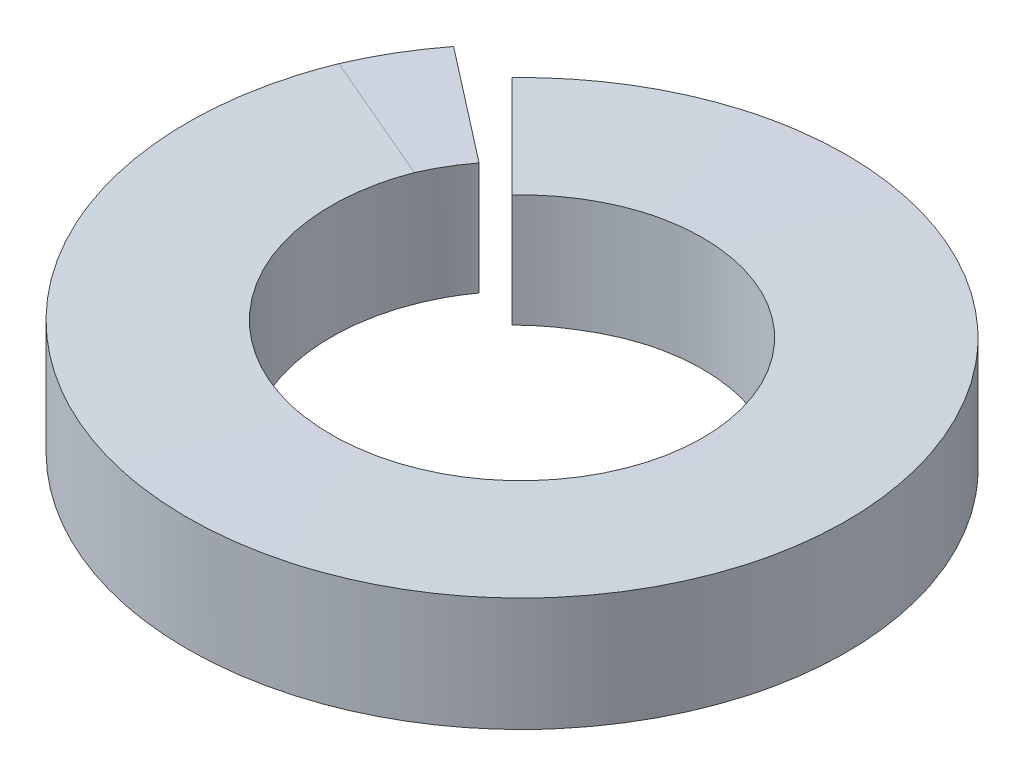
ISO-10303-21;
HEADER;
FILE_DESCRIPTION(('STEP AP214'),'2;1');
FILE_NAME('part.step','',(''),(''),'','','');
FILE_SCHEMA(('AUTOMOTIVE_DESIGN { 1 0 10303 214 1 1 1 1 }'));
ENDSEC;
DATA;
#1=APPLICATION_CONTEXT('core data for automotive mechanical design processes');
#2=APPLICATION_PROTOCOL_DEFINITION('international standard','automotive_design',2000,#1);
#3=PRODUCT_CONTEXT('',#1,'mechanical');
#4=PRODUCT('Part','Part','',(#3));
#5=PRODUCT_RELATED_PRODUCT_CATEGORY('part','',(#4));
#6=PRODUCT_DEFINITION_FORMATION('','',#4);
#7=PRODUCT_DEFINITION_CONTEXT('part definition',#1,'design');
#8=PRODUCT_DEFINITION('design','',#6,#7);
#9=PRODUCT_DEFINITION_SHAPE('','',#8);
#10=(LENGTH_UNIT() NAMED_UNIT(*) SI_UNIT(.MILLI.,.METRE.));
#11=(NAMED_UNIT(*) PLANE_ANGLE_UNIT() SI_UNIT($,.RADIAN.));
#12=(NAMED_UNIT(*) SI_UNIT($,.STERADIAN.) SOLID_ANGLE_UNIT());
#13=UNCERTAINTY_MEASURE_WITH_UNIT(LENGTH_MEASURE(1.E-05),#10,'distance_accuracy_value','');
#14=(GEOMETRIC_REPRESENTATION_CONTEXT(3) GLOBAL_UNCERTAINTY_ASSIGNED_CONTEXT((#13)) GLOBAL_UNIT_ASSIGNED_CONTEXT((#10,
#11,#12)) REPRESENTATION_CONTEXT('',''));
#15=CARTESIAN_POINT('',(0.,0.,0.));
#16=DIRECTION('',(0.,0.,1.));
#17=DIRECTION('',(1.,0.,0.));
#18=AXIS2_PLACEMENT_3D('',#15,#16,#17);
#19=CARTESIAN_POINT('',(0.,-0.0956628975394009,0.));
#20=DIRECTION('',(0.707113186219945,0.,-0.707100376095132));
#21=DIRECTION('',(-0.707100376095132,0.,-0.707113186219945));
#22=AXIS2_PLACEMENT_3D('',#19,#20,#21);
#23=PLANE('',#22);
#24=DIRECTION('',(0.,1.,0.));
#25=VECTOR('',#24,1.);
#26=CARTESIAN_POINT('',(-1.94452603426161,0.379337102460599,-1.94456126210485));
#27=LINE('',#26,#25);
#28=CARTESIAN_POINT('',(-1.94452603426161,-0.560662897539401,-1.94456126210485));
#29=VERTEX_POINT('',#28);
#30=CARTESIAN_POINT('',(-1.94452603426161,0.379337102460599,-1.94456126210485));
#31=VERTEX_POINT('',#30);
#32=EDGE_CURVE('E110',#29,#31,#27,.T.);
#33=ORIENTED_EDGE('',*,*,#32,.F.);
#34=DIRECTION('',(0.707100376095132,0.,0.707113186219945));
#35=VECTOR('',#34,1.);
#36=CARTESIAN_POINT('',(0.,-0.560662897539401,0.));
#37=LINE('',#36,#35);
#38=CARTESIAN_POINT('',(-1.09600558294745,-0.560662897539402,-1.09602543864091));
#39=VERTEX_POINT('',#38);
#40=EDGE_CURVE('E47',#29,#39,#37,.T.);
#41=ORIENTED_EDGE('',*,*,#40,.T.);
#42=DIRECTION('',(0.,-1.,0.));
#43=VECTOR('',#42,1.);
#44=CARTESIAN_POINT('',(-1.09600558294745,0.379337102460599,-1.09602543864091));
#45=LINE('',#44,#43);
#46=CARTESIAN_POINT('',(-1.09600558294745,0.379337102460599,-1.09602543864091));
#47=VERTEX_POINT('',#46);
#48=EDGE_CURVE('E134',#47,#39,#45,.T.);
#49=ORIENTED_EDGE('',*,*,#48,.F.);
#50=DIRECTION('',(0.707100376095132,0.,0.707113186219945));
#51=VECTOR('',#50,1.);
#52=CARTESIAN_POINT('',(-1.09600558294745,0.379337102460599,-1.09602543864091));
#53=LINE('',#52,#51);
#54=EDGE_CURVE('E105',#31,#47,#53,.T.);
#55=ORIENTED_EDGE('',*,*,#54,.F.);
#56=EDGE_LOOP('',(#33,#41,#49,#55));
#57=FACE_BOUND('',#56,.T.);
#58=ADVANCED_FACE('F34',(#57),#23,.F.);
#59=CARTESIAN_POINT('',(0.,0.154337102460599,0.));
#60=DIRECTION('',(0.612914210951601,0.,-0.790149460553873));
#61=DIRECTION('',(-0.790149460553873,0.,-0.612914210951601));
#62=AXIS2_PLACEMENT_3D('',#59,#60,#61);
#63=PLANE('',#62);
#64=DIRECTION('',(-0.790149460553873,0.,-0.612914210951601));
#65=VECTOR('',#64,1.);
#66=CARTESIAN_POINT('',(0.,0.619337102460599,0.));
#67=LINE('',#66,#65);
#68=CARTESIAN_POINT('',(-1.2247316638585,0.619337102460599,-0.950017026974984));
#69=VERTEX_POINT('',#68);
#70=CARTESIAN_POINT('',(-2.17291101652315,0.619337102460599,-1.68551408011691));
#71=VERTEX_POINT('',#70);
#72=EDGE_CURVE('E100',#69,#71,#67,.T.);
#73=ORIENTED_EDGE('',*,*,#72,.F.);
#74=DIRECTION('',(0.,-1.,0.));
#75=VECTOR('',#74,1.);
#76=CARTESIAN_POINT('',(-1.2247316638585,0.629337102460599,-0.950017026974982));
#77=LINE('',#76,#75);
#78=CARTESIAN_POINT('',(-1.2247316638585,-0.320662897539401,-0.950017026974984));
#79=VERTEX_POINT('',#78);
#80=EDGE_CURVE('E99',#69,#79,#77,.T.);
#81=ORIENTED_EDGE('',*,*,#80,.T.);
#82=DIRECTION('',(-0.790149460553873,0.,-0.612914210951601));
#83=VECTOR('',#82,1.);
#84=CARTESIAN_POINT('',(-1.2247316638585,-0.320662897539401,-0.950017026974982));
#85=LINE('',#84,#83);
#86=CARTESIAN_POINT('',(-2.17291101652315,-0.320662897539401,-1.68551408011691));
#87=VERTEX_POINT('',#86);
#88=EDGE_CURVE('E118',#79,#87,#85,.T.);
#89=ORIENTED_EDGE('',*,*,#88,.T.);
#90=DIRECTION('',(0.,1.,0.));
#91=VECTOR('',#90,1.);
#92=CARTESIAN_POINT('',(-2.17291101652315,0.629337102460599,-1.6855140801169));
#93=LINE('',#92,#91);
#94=EDGE_CURVE('E90',#87,#71,#93,.T.);
#95=ORIENTED_EDGE('',*,*,#94,.T.);
#96=EDGE_LOOP('',(#73,#81,#89,#95));
#97=FACE_BOUND('',#96,.T.);
#98=ADVANCED_FACE('F194',(#97),#63,.T.);
#99=CARTESIAN_POINT('',(0.,0.,0.));
#100=DIRECTION('',(0.,1.,0.));
#101=DIRECTION('',(0.,0.,1.));
#102=AXIS2_PLACEMENT_3D('',#99,#100,#101);
#103=CYLINDRICAL_SURFACE('',#102,1.55);
#104=CARTESIAN_POINT('',(0.,-0.560662897539401,0.));
#105=DIRECTION('',(0.,1.,0.));
#106=DIRECTION('',(-1.,0.,0.));
#107=AXIS2_PLACEMENT_3D('',#104,#105,#106);
#108=CIRCLE('',#107,1.55);
#109=CARTESIAN_POINT('',(-0.784097116493194,-0.560662897539402,-1.337045889978));
#110=VERTEX_POINT('',#109);
#111=EDGE_CURVE('E167',#110,#39,#108,.T.);
#112=ORIENTED_EDGE('',*,*,#111,.F.);
#113=CARTESIAN_POINT('',(-1.09600558294745,-0.570662897539401,-1.09602543864091));
#114=CARTESIAN_POINT('',(-0.478426987407626,-0.549829564206068,-1.71359284607247));
#115=CARTESIAN_POINT('',(0.369740494049661,-0.528996230872735,-1.50525478476566));
#116=CARTESIAN_POINT('',(1.21790797550695,-0.508162897539401,-1.29691672345885));
#117=CARTESIAN_POINT('',(1.47907670770083,-0.487329564206068,-0.463499830352577));
#118=CARTESIAN_POINT('',(1.74024543989472,-0.466496230872734,0.369917062753697));
#119=CARTESIAN_POINT('',(1.16266287299777,-0.445662897539401,1.02504392284066));
#120=CARTESIAN_POINT('',(0.585080306100818,-0.424829564206068,1.68017078292763));
#121=CARTESIAN_POINT('',(-0.274495165684428,-0.403996230872734,1.52550070600307));
#122=CARTESIAN_POINT('',(-1.13407063746967,-0.383162897539401,1.37083062907852));
#123=CARTESIAN_POINT('',(-1.44705469253154,-0.362329564206068,0.555457214214071));
#124=CARTESIAN_POINT('',(-1.7600387475934,-0.341496230872734,-0.259916200650374));
#125=CARTESIAN_POINT('',(-1.2247316638585,-0.320662897539401,-0.950017026974986));
#126=(BOUNDED_CURVE() B_SPLINE_CURVE(2,(#113,#114,#115,#116,#117,#118,#119,#120,#121,#122,#123,
#124,#125),.UNSPECIFIED.,.F.,.F.) B_SPLINE_CURVE_WITH_KNOTS((3,2,2,2,2,2,3),(0.,
0.166666666666667,0.333333333333333,0.5,0.666666666666667,0.833333333333333,1.),
.UNSPECIFIED.) CURVE() GEOMETRIC_REPRESENTATION_ITEM() RATIONAL_B_SPLINE_CURVE((1.,
0.871213811120189,1.,0.871213811120189,1.,0.871213811120189,1.,0.871213811120189,1.,
0.871213811120189,1.,0.871213811120189,1.)) REPRESENTATION_ITEM(''));
#127=EDGE_CURVE('E106',#110,#79,#126,.T.);
#128=ORIENTED_EDGE('',*,*,#127,.T.);
#129=ORIENTED_EDGE('',*,*,#80,.F.);
#130=CARTESIAN_POINT('',(0.,0.619337102460599,0.));
#131=DIRECTION('',(0.,-1.,0.));
#132=DIRECTION('',(1.,0.,0.));
#133=AXIS2_PLACEMENT_3D('',#130,#131,#132);
#134=CIRCLE('',#133,1.55);
#135=CARTESIAN_POINT('',(-1.42476525354699,0.619337102460599,-0.610363803223271));
#136=VERTEX_POINT('',#135);
#137=EDGE_CURVE('E84',#136,#69,#134,.T.);
#138=ORIENTED_EDGE('',*,*,#137,.F.);
#139=CARTESIAN_POINT('',(-1.09600558294745,0.379337102460599,-1.09602543864091));
#140=CARTESIAN_POINT('',(-0.478426987407627,0.400170435793932,-1.71359284607247));
#141=CARTESIAN_POINT('',(0.36974049404966,0.421003769127266,-1.50525478476566));
#142=CARTESIAN_POINT('',(1.21790797550695,0.441837102460599,-1.29691672345885));
#143=CARTESIAN_POINT('',(1.47907670770083,0.462670435793932,-0.463499830352579));
#144=CARTESIAN_POINT('',(1.74024543989472,0.483503769127266,0.369917062753694));
#145=CARTESIAN_POINT('',(1.16266287299777,0.504337102460599,1.02504392284066));
#146=CARTESIAN_POINT('',(0.585080306100822,0.525170435793932,1.68017078292763));
#147=CARTESIAN_POINT('',(-0.274495165684424,0.546003769127266,1.52550070600307));
#148=CARTESIAN_POINT('',(-1.13407063746967,0.566837102460599,1.37083062907852));
#149=CARTESIAN_POINT('',(-1.44705469253154,0.587670435793932,0.555457214214076));
#150=CARTESIAN_POINT('',(-1.7600387475934,0.608503769127266,-0.259916200650368));
#151=CARTESIAN_POINT('',(-1.2247316638585,0.629337102460599,-0.950017026974982));
#152=(BOUNDED_CURVE() B_SPLINE_CURVE(2,(#139,#140,#141,#142,#143,#144,#145,#146,#147,#148,#149,
#150,#151),.UNSPECIFIED.,.F.,.F.) B_SPLINE_CURVE_WITH_KNOTS((3,2,2,2,2,2,3),(0.,
0.166666666666667,0.333333333333333,0.5,0.666666666666667,0.833333333333333,1.),
.UNSPECIFIED.) CURVE() GEOMETRIC_REPRESENTATION_ITEM() RATIONAL_B_SPLINE_CURVE((1.,
0.871213811120189,1.,0.871213811120189,1.,0.871213811120189,1.,0.871213811120189,1.,
0.871213811120189,1.,0.871213811120189,1.)) REPRESENTATION_ITEM(''));
#153=EDGE_CURVE('E97',#47,#136,#152,.T.);
#154=ORIENTED_EDGE('',*,*,#153,.F.);
#155=ORIENTED_EDGE('',*,*,#48,.T.);
#156=EDGE_LOOP('',(#112,#128,#129,#138,#154,#155));
#157=FACE_BOUND('',#156,.T.);
#158=ADVANCED_FACE('F95',(#157),#103,.F.);
#159=CARTESIAN_POINT('',(-1.09600558294745,-0.570662897539401,-1.09602543864091));
#160=CARTESIAN_POINT('',(-0.478426987407626,-0.549829564206068,-1.71359284607247));
#161=CARTESIAN_POINT('',(0.369740494049661,-0.528996230872735,-1.50525478476566));
#162=CARTESIAN_POINT('',(1.21790797550695,-0.508162897539401,-1.29691672345885));
#163=CARTESIAN_POINT('',(1.47907670770083,-0.487329564206068,-0.463499830352577));
#164=CARTESIAN_POINT('',(1.74024543989472,-0.466496230872734,0.369917062753697));
#165=CARTESIAN_POINT('',(1.16266287299777,-0.445662897539401,1.02504392284066));
#166=CARTESIAN_POINT('',(0.585080306100818,-0.424829564206068,1.68017078292763));
#167=CARTESIAN_POINT('',(-0.274495165684428,-0.403996230872734,1.52550070600307));
#168=CARTESIAN_POINT('',(-1.13407063746967,-0.383162897539401,1.37083062907852));
#169=CARTESIAN_POINT('',(-1.44705469253154,-0.362329564206068,0.555457214214071));
#170=CARTESIAN_POINT('',(-1.7600387475934,-0.341496230872734,-0.259916200650374));
#171=CARTESIAN_POINT('',(-1.2247316638585,-0.320662897539401,-0.950017026974986));
#172=CARTESIAN_POINT('',(-1.94452603426161,-0.570662897539401,-1.94456126210485));
#173=CARTESIAN_POINT('',(-0.848822074432886,-0.549829564206068,-3.04024537206406));
#174=CARTESIAN_POINT('',(0.655991199120366,-0.528996230872735,-2.67061332781004));
#175=CARTESIAN_POINT('',(2.16080447267362,-0.508162897539401,-2.30098128355603));
#176=CARTESIAN_POINT('',(2.62416835237244,-0.487329564206068,-0.822338408690056));
#177=CARTESIAN_POINT('',(3.08753223207127,-0.466496230872734,0.656304466175915));
#178=CARTESIAN_POINT('',(2.06278896822185,-0.445662897539401,1.81862631471731));
#179=CARTESIAN_POINT('',(1.03804570437242,-0.424829564206068,2.9809481632587));
#180=CARTESIAN_POINT('',(-0.487007552020759,-0.403996230872734,2.70653351065062));
#181=CARTESIAN_POINT('',(-2.01206080841394,-0.383162897539401,2.43211885804253));
#182=CARTESIAN_POINT('',(-2.56735509965273,-0.362329564206068,0.985488605863675));
#183=CARTESIAN_POINT('',(-3.12264939089152,-0.341496230872734,-0.46114164631518));
#184=CARTESIAN_POINT('',(-2.17291101652314,-0.320662897539401,-1.68551408011691));
#185=(BOUNDED_SURFACE() B_SPLINE_SURFACE(1,2,((#159,#160,#161,#162,#163,#164,#165,#166,#167,
#168,#169,#170,#171),(#172,#173,#174,#175,#176,#177,#178,#179,#180,#181,#182,#183,#184)),
.UNSPECIFIED.,.F.,.F.,.F.) B_SPLINE_SURFACE_WITH_KNOTS((2,2),(3,2,2,2,2,2,3),(0.,1.),(0.,
0.166666666666667,0.333333333333333,0.5,0.666666666666667,0.833333333333333,1.),
.UNSPECIFIED.) GEOMETRIC_REPRESENTATION_ITEM() RATIONAL_B_SPLINE_SURFACE(((1.,0.871213811120189,
1.,0.871213811120189,1.,0.871213811120189,1.,0.871213811120189,1.,0.871213811120189,1.,
0.871213811120189,1.),(1.,0.871213811120189,1.,0.871213811120189,1.,0.871213811120189,1.,
0.871213811120189,1.,0.871213811120189,1.,0.871213811120189,1.))) REPRESENTATION_ITEM('') SURFACE());
#186=CARTESIAN_POINT('',(-1.39114004539116,-0.560662897539402,-2.37217819189644));
#187=CARTESIAN_POINT('',(-1.33307518221314,-0.560662897539402,-2.27316572898684));
#188=CARTESIAN_POINT('',(-1.27501031903511,-0.560662897539402,-2.17415326607724));
#189=CARTESIAN_POINT('',(-1.15888059267907,-0.560662897539402,-1.97612834025804));
#190=CARTESIAN_POINT('',(-1.10081572950105,-0.560662897539402,-1.87711587734844));
#191=CARTESIAN_POINT('',(-0.956532949713081,-0.560662897539402,-1.63108423961856));
#192=CARTESIAN_POINT('',(-0.870315033103138,-0.560662897539402,-1.48406506479828));
#193=CARTESIAN_POINT('',(-0.784097116493195,-0.560662897539402,-1.337045889978));
#194=B_SPLINE_CURVE_WITH_KNOTS('',3,(#186,#187,#188,#189,#190,#191,#192,#193),.UNSPECIFIED.,.F.,
.F.,(4,2,2,4),(0.,0.344347158149692,0.688694316299385,1.2),.UNSPECIFIED.);
#195=CARTESIAN_POINT('',(-1.39114004539115,-0.560662897539402,-2.37217819189645));
#196=VERTEX_POINT('',#195);
#197=EDGE_CURVE('E161',#196,#110,#194,.T.);
#198=CARTESIAN_POINT('',(-1.94452603426161,-0.570662897539401,-1.94456126210485));
#199=CARTESIAN_POINT('',(-0.848822074432886,-0.549829564206068,-3.04024537206406));
#200=CARTESIAN_POINT('',(0.655991199120365,-0.528996230872735,-2.67061332781004));
#201=CARTESIAN_POINT('',(2.16080447267362,-0.508162897539401,-2.30098128355603));
#202=CARTESIAN_POINT('',(2.62416835237244,-0.487329564206068,-0.822338408690057));
#203=CARTESIAN_POINT('',(3.08753223207127,-0.466496230872734,0.656304466175914));
#204=CARTESIAN_POINT('',(2.06278896822185,-0.445662897539401,1.81862631471731));
#205=CARTESIAN_POINT('',(1.03804570437242,-0.424829564206068,2.9809481632587));
#206=CARTESIAN_POINT('',(-0.487007552020758,-0.403996230872734,2.70653351065062));
#207=CARTESIAN_POINT('',(-2.01206080841394,-0.383162897539401,2.43211885804253));
#208=CARTESIAN_POINT('',(-2.56735509965273,-0.362329564206068,0.985488605863675));
#209=CARTESIAN_POINT('',(-3.12264939089152,-0.341496230872734,-0.46114164631518));
#210=CARTESIAN_POINT('',(-2.17291101652314,-0.320662897539401,-1.68551408011691));
#211=(BOUNDED_CURVE() B_SPLINE_CURVE(2,(#198,#199,#200,#201,#202,#203,#204,#205,#206,#207,#208,
#209,#210),.UNSPECIFIED.,.F.,.F.) B_SPLINE_CURVE_WITH_KNOTS((3,2,2,2,2,2,3),(0.,
0.166666666666667,0.333333333333333,0.5,0.666666666666667,0.833333333333333,1.),
.UNSPECIFIED.) CURVE() GEOMETRIC_REPRESENTATION_ITEM() RATIONAL_B_SPLINE_CURVE((1.,
0.871213811120189,1.,0.871213811120189,1.,0.871213811120189,1.,0.871213811120189,1.,
0.871213811120189,1.,0.871213811120189,1.)) REPRESENTATION_ITEM(''));
#212=EDGE_CURVE('E108',#196,#87,#211,.T.);
#213=ORIENTED_EDGE('',*,*,#197,.F.);
#214=ORIENTED_EDGE('',*,*,#212,.T.);
#215=ORIENTED_EDGE('',*,*,#88,.F.);
#216=ORIENTED_EDGE('',*,*,#127,.F.);
#217=EDGE_LOOP('',(#213,#214,#215,#216));
#218=FACE_BOUND('',#217,.T.);
#219=ADVANCED_FACE('F169',(#218),#185,.T.);
#220=CARTESIAN_POINT('',(0.,0.,0.));
#221=DIRECTION('',(0.,1.,0.));
#222=DIRECTION('',(0.,0.,1.));
#223=AXIS2_PLACEMENT_3D('',#220,#221,#222);
#224=CYLINDRICAL_SURFACE('',#223,2.75);
#225=CARTESIAN_POINT('',(0.,-0.560662897539401,0.));
#226=DIRECTION('',(0.,1.,0.));
#227=DIRECTION('',(-1.,0.,0.));
#228=AXIS2_PLACEMENT_3D('',#225,#226,#227);
#229=CIRCLE('',#228,2.75);
#230=EDGE_CURVE('E12',#29,#196,#229,.F.);
#231=ORIENTED_EDGE('',*,*,#230,.F.);
#232=ORIENTED_EDGE('',*,*,#32,.T.);
#233=CARTESIAN_POINT('',(-1.94452603426161,0.379337102460599,-1.94456126210485));
#234=CARTESIAN_POINT('',(-0.848822074432887,0.400170435793932,-3.04024537206405));
#235=CARTESIAN_POINT('',(0.655991199120364,0.421003769127266,-2.67061332781004));
#236=CARTESIAN_POINT('',(2.16080447267361,0.441837102460599,-2.30098128355603));
#237=CARTESIAN_POINT('',(2.62416835237244,0.462670435793932,-0.82233840869006));
#238=CARTESIAN_POINT('',(3.08753223207127,0.483503769127266,0.656304466175909));
#239=CARTESIAN_POINT('',(2.06278896822185,0.504337102460599,1.8186263147173));
#240=CARTESIAN_POINT('',(1.03804570437243,0.525170435793932,2.9809481632587));
#241=CARTESIAN_POINT('',(-0.487007552020751,0.546003769127266,2.70653351065062));
#242=CARTESIAN_POINT('',(-2.01206080841393,0.566837102460599,2.43211885804254));
#243=CARTESIAN_POINT('',(-2.56735509965272,0.587670435793932,0.985488605863684));
#244=CARTESIAN_POINT('',(-3.12264939089152,0.608503769127266,-0.461141646315168));
#245=CARTESIAN_POINT('',(-2.17291101652315,0.629337102460599,-1.6855140801169));
#246=(BOUNDED_CURVE() B_SPLINE_CURVE(2,(#233,#234,#235,#236,#237,#238,#239,#240,#241,#242,#243,
#244,#245),.UNSPECIFIED.,.F.,.F.) B_SPLINE_CURVE_WITH_KNOTS((3,2,2,2,2,2,3),(0.,
0.166666666666667,0.333333333333333,0.5,0.666666666666667,0.833333333333333,1.),
.UNSPECIFIED.) CURVE() GEOMETRIC_REPRESENTATION_ITEM() RATIONAL_B_SPLINE_CURVE((1.,
0.871213811120189,1.,0.871213811120189,1.,0.871213811120189,1.,0.871213811120189,1.,
0.871213811120189,1.,0.871213811120189,1.)) REPRESENTATION_ITEM(''));
#247=CARTESIAN_POINT('',(-2.52780932080919,0.619337102460599,-1.08290352184772));
#248=VERTEX_POINT('',#247);
#249=EDGE_CURVE('E128',#31,#248,#246,.T.);
#250=ORIENTED_EDGE('',*,*,#249,.T.);
#251=CARTESIAN_POINT('',(0.,0.619337102460599,0.));
#252=DIRECTION('',(0.,-1.,0.));
#253=DIRECTION('',(1.,0.,0.));
#254=AXIS2_PLACEMENT_3D('',#251,#252,#253);
#255=CIRCLE('',#254,2.75);
#256=EDGE_CURVE('E55',#71,#248,#255,.F.);
#257=ORIENTED_EDGE('',*,*,#256,.F.);
#258=ORIENTED_EDGE('',*,*,#94,.F.);
#259=ORIENTED_EDGE('',*,*,#212,.F.);
#260=EDGE_LOOP('',(#231,#232,#250,#257,#258,#259));
#261=FACE_BOUND('',#260,.T.);
#262=ADVANCED_FACE('F174',(#261),#224,.T.);
#263=CARTESIAN_POINT('',(-1.94452603426161,0.379337102460599,-1.94456126210485));
#264=CARTESIAN_POINT('',(-0.848822074432886,0.400170435793932,-3.04024537206405));
#265=CARTESIAN_POINT('',(0.655991199120364,0.421003769127266,-2.67061332781004));
#266=CARTESIAN_POINT('',(2.16080447267361,0.441837102460599,-2.30098128355603));
#267=CARTESIAN_POINT('',(2.62416835237244,0.462670435793932,-0.82233840869006));
#268=CARTESIAN_POINT('',(3.08753223207127,0.483503769127266,0.656304466175909));
#269=CARTESIAN_POINT('',(2.06278896822185,0.504337102460599,1.8186263147173));
#270=CARTESIAN_POINT('',(1.03804570437243,0.525170435793932,2.9809481632587));
#271=CARTESIAN_POINT('',(-0.487007552020752,0.546003769127266,2.70653351065062));
#272=CARTESIAN_POINT('',(-2.01206080841393,0.566837102460599,2.43211885804254));
#273=CARTESIAN_POINT('',(-2.56735509965272,0.587670435793932,0.985488605863684));
#274=CARTESIAN_POINT('',(-3.12264939089152,0.608503769127266,-0.461141646315169));
#275=CARTESIAN_POINT('',(-2.17291101652315,0.629337102460599,-1.6855140801169));
#276=CARTESIAN_POINT('',(-1.09600558294745,0.379337102460599,-1.09602543864091));
#277=CARTESIAN_POINT('',(-0.478426987407627,0.400170435793932,-1.71359284607247));
#278=CARTESIAN_POINT('',(0.36974049404966,0.421003769127266,-1.50525478476566));
#279=CARTESIAN_POINT('',(1.21790797550695,0.441837102460599,-1.29691672345885));
#280=CARTESIAN_POINT('',(1.47907670770083,0.462670435793932,-0.463499830352579));
#281=CARTESIAN_POINT('',(1.74024543989472,0.483503769127266,0.369917062753694));
#282=CARTESIAN_POINT('',(1.16266287299777,0.504337102460599,1.02504392284066));
#283=CARTESIAN_POINT('',(0.585080306100822,0.525170435793932,1.68017078292763));
#284=CARTESIAN_POINT('',(-0.274495165684424,0.546003769127266,1.52550070600307));
#285=CARTESIAN_POINT('',(-1.13407063746967,0.566837102460599,1.37083062907852));
#286=CARTESIAN_POINT('',(-1.44705469253154,0.587670435793932,0.555457214214076));
#287=CARTESIAN_POINT('',(-1.7600387475934,0.608503769127266,-0.259916200650368));
#288=CARTESIAN_POINT('',(-1.2247316638585,0.629337102460599,-0.950017026974982));
#289=(BOUNDED_SURFACE() B_SPLINE_SURFACE(1,2,((#263,#264,#265,#266,#267,#268,#269,#270,#271,
#272,#273,#274,#275),(#276,#277,#278,#279,#280,#281,#282,#283,#284,#285,#286,#287,#288)),
.UNSPECIFIED.,.F.,.F.,.F.) B_SPLINE_SURFACE_WITH_KNOTS((2,2),(3,2,2,2,2,2,3),(0.,1.),(0.,
0.166666666666667,0.333333333333333,0.5,0.666666666666667,0.833333333333333,1.),
.UNSPECIFIED.) GEOMETRIC_REPRESENTATION_ITEM() RATIONAL_B_SPLINE_SURFACE(((1.,0.871213811120189,
1.,0.871213811120189,1.,0.871213811120189,1.,0.871213811120189,1.,0.871213811120189,1.,
0.871213811120189,1.),(1.,0.871213811120189,1.,0.871213811120189,1.,0.871213811120189,1.,
0.871213811120189,1.,0.871213811120189,1.,0.871213811120189,1.))) REPRESENTATION_ITEM('') SURFACE());
#290=CARTESIAN_POINT('',(-2.52780932080918,0.619337102460599,-1.08290352184774));
#291=CARTESIAN_POINT('',(-2.4223009625104,0.619337102460599,-1.03770415817519));
#292=CARTESIAN_POINT('',(-2.31679260421162,0.619337102460599,-0.992504794502631));
#293=CARTESIAN_POINT('',(-2.10577588761405,0.619337102460599,-0.902106067157525));
#294=CARTESIAN_POINT('',(-2.00026752931527,0.619337102460599,-0.856906703484973));
#295=CARTESIAN_POINT('',(-1.73809453185999,0.619337102460599,-0.744592827616039));
#296=CARTESIAN_POINT('',(-1.58142989270349,0.619337102460599,-0.677478315419657));
#297=CARTESIAN_POINT('',(-1.42476525354699,0.619337102460599,-0.610363803223271));
#298=B_SPLINE_CURVE_WITH_KNOTS('',3,(#290,#291,#292,#293,#294,#295,#296,#297),.UNSPECIFIED.,.F.,
.F.,(4,2,2,4),(0.,0.344347158149693,0.688694316299385,1.2),.UNSPECIFIED.);
#299=EDGE_CURVE('E41',#248,#136,#298,.T.);
#300=ORIENTED_EDGE('',*,*,#299,.F.);
#301=ORIENTED_EDGE('',*,*,#249,.F.);
#302=ORIENTED_EDGE('',*,*,#54,.T.);
#303=ORIENTED_EDGE('',*,*,#153,.T.);
#304=EDGE_LOOP('',(#300,#301,#302,#303));
#305=FACE_BOUND('',#304,.T.);
#306=ADVANCED_FACE('F103',(#305),#289,.T.);
#307=CARTESIAN_POINT('',(3.05186845216377,0.619337102460599,10.));
#308=DIRECTION('',(0.,-1.,0.));
#309=DIRECTION('',(1.,0.,0.));
#310=AXIS2_PLACEMENT_3D('',#307,#308,#309);
#311=PLANE('',#310);
#312=ORIENTED_EDGE('',*,*,#72,.T.);
#313=ORIENTED_EDGE('',*,*,#256,.T.);
#314=ORIENTED_EDGE('',*,*,#299,.T.);
#315=ORIENTED_EDGE('',*,*,#137,.T.);
#316=EDGE_LOOP('',(#312,#313,#314,#315));
#317=FACE_BOUND('',#316,.T.);
#318=ADVANCED_FACE('F83',(#317),#311,.F.);
#319=CARTESIAN_POINT('',(3.05186845216377,-0.560662897539401,10.));
#320=DIRECTION('',(0.,1.,0.));
#321=DIRECTION('',(-1.,0.,0.));
#322=AXIS2_PLACEMENT_3D('',#319,#320,#321);
#323=PLANE('',#322);
#324=ORIENTED_EDGE('',*,*,#230,.T.);
#325=ORIENTED_EDGE('',*,*,#197,.T.);
#326=ORIENTED_EDGE('',*,*,#111,.T.);
#327=ORIENTED_EDGE('',*,*,#40,.F.);
#328=EDGE_LOOP('',(#324,#325,#326,#327));
#329=FACE_BOUND('',#328,.T.);
#330=ADVANCED_FACE('F155',(#329),#323,.F.);
#331=CLOSED_SHELL('',(#58,#98,#158,#219,#262,#306,#318,#330));
#332=MANIFOLD_SOLID_BREP('B2',#331);
#333=ADVANCED_BREP_SHAPE_REPRESENTATION('',(#18,#332),#14);
#334=SHAPE_DEFINITION_REPRESENTATION(#9,#333);
ENDSEC;
END-ISO-10303-21;
